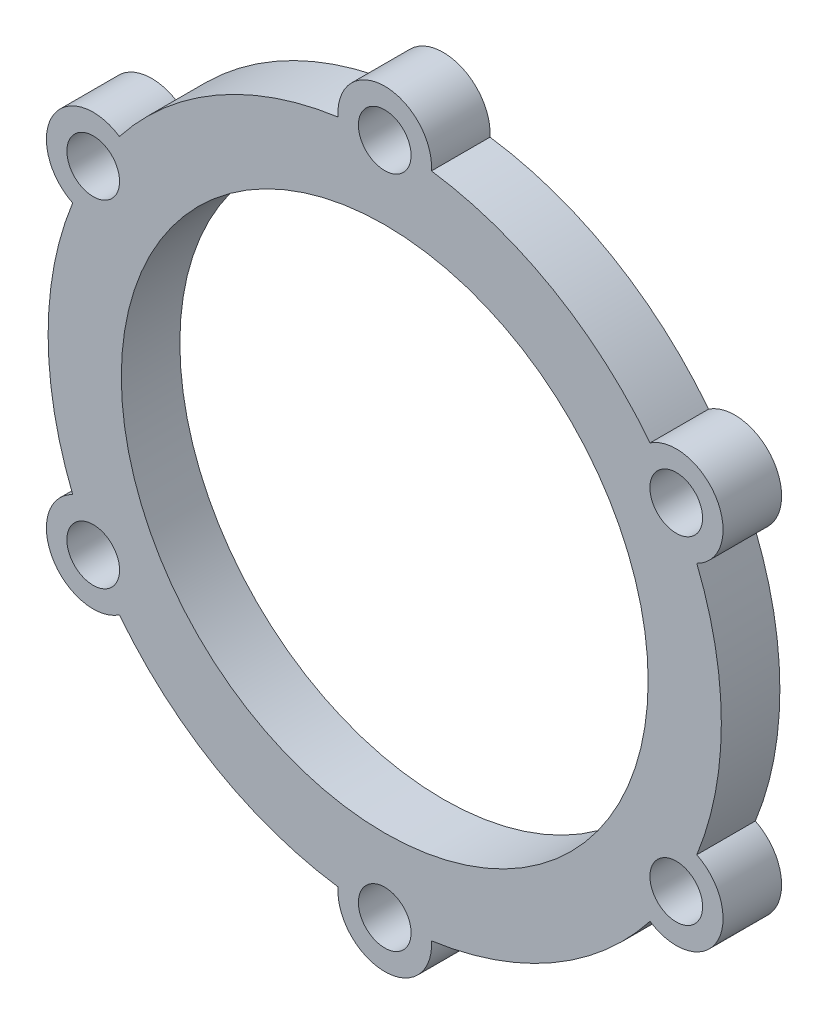
ISO-10303-21;
HEADER;
FILE_DESCRIPTION(('STEP AP214'),'2;1');
FILE_NAME('part.step','',(''),(''),'','','');
FILE_SCHEMA(('AUTOMOTIVE_DESIGN { 1 0 10303 214 1 1 1 1 }'));
ENDSEC;
DATA;
#1=APPLICATION_CONTEXT('core data for automotive mechanical design processes');
#2=APPLICATION_PROTOCOL_DEFINITION('international standard','automotive_design',2000,#1);
#3=PRODUCT_CONTEXT('',#1,'mechanical');
#4=PRODUCT('Part','Part','',(#3));
#5=PRODUCT_RELATED_PRODUCT_CATEGORY('part','',(#4));
#6=PRODUCT_DEFINITION_FORMATION('','',#4);
#7=PRODUCT_DEFINITION_CONTEXT('part definition',#1,'design');
#8=PRODUCT_DEFINITION('design','',#6,#7);
#9=PRODUCT_DEFINITION_SHAPE('','',#8);
#10=(LENGTH_UNIT() NAMED_UNIT(*) SI_UNIT(.MILLI.,.METRE.));
#11=(NAMED_UNIT(*) PLANE_ANGLE_UNIT() SI_UNIT($,.RADIAN.));
#12=(NAMED_UNIT(*) SI_UNIT($,.STERADIAN.) SOLID_ANGLE_UNIT());
#13=UNCERTAINTY_MEASURE_WITH_UNIT(LENGTH_MEASURE(1.E-05),#10,'distance_accuracy_value','');
#14=(GEOMETRIC_REPRESENTATION_CONTEXT(3) GLOBAL_UNCERTAINTY_ASSIGNED_CONTEXT((#13)) GLOBAL_UNIT_ASSIGNED_CONTEXT((#10,
#11,#12)) REPRESENTATION_CONTEXT('',''));
#15=CARTESIAN_POINT('',(0.,0.,0.));
#16=DIRECTION('',(0.,0.,1.));
#17=DIRECTION('',(1.,0.,0.));
#18=AXIS2_PLACEMENT_3D('',#15,#16,#17);
#19=CARTESIAN_POINT('',(0.,57.4999999999994,10.));
#20=DIRECTION('',(0.,0.,-1.));
#21=DIRECTION('',(-1.,0.,0.));
#22=AXIS2_PLACEMENT_3D('',#19,#20,#21);
#23=CYLINDRICAL_SURFACE('',#22,4.50000000000047);
#24=CARTESIAN_POINT('',(0.,57.4999999999994,10.));
#25=DIRECTION('',(0.,0.,1.));
#26=DIRECTION('',(1.,0.,0.));
#27=AXIS2_PLACEMENT_3D('',#24,#25,#26);
#28=CIRCLE('',#27,4.50000000000047);
#29=CARTESIAN_POINT('',(4.50000000000045,57.4999999999994,10.));
#30=VERTEX_POINT('',#29);
#31=EDGE_CURVE('E261',#30,#30,#28,.T.);
#32=ORIENTED_EDGE('',*,*,#31,.T.);
#33=EDGE_LOOP('',(#32));
#34=FACE_BOUND('',#33,.T.);
#35=CARTESIAN_POINT('',(0.,57.4999999999994,0.));
#36=DIRECTION('',(0.,0.,1.));
#37=DIRECTION('',(1.,0.,0.));
#38=AXIS2_PLACEMENT_3D('',#35,#36,#37);
#39=CIRCLE('',#38,4.50000000000047);
#40=CARTESIAN_POINT('',(4.50000000000045,57.4999999999994,0.));
#41=VERTEX_POINT('',#40);
#42=EDGE_CURVE('E302',#41,#41,#39,.T.);
#43=ORIENTED_EDGE('',*,*,#42,.F.);
#44=EDGE_LOOP('',(#43));
#45=FACE_BOUND('',#44,.T.);
#46=ADVANCED_FACE('F125',(#34,#45),#23,.F.);
#47=CARTESIAN_POINT('',(-49.796460717603,28.7499999999985,10.));
#48=DIRECTION('',(0.,0.,-1.));
#49=DIRECTION('',(-1.,0.,0.));
#50=AXIS2_PLACEMENT_3D('',#47,#48,#49);
#51=CYLINDRICAL_SURFACE('',#50,4.50000000000198);
#52=CARTESIAN_POINT('',(-49.796460717603,28.7499999999985,10.));
#53=DIRECTION('',(0.,0.,1.));
#54=DIRECTION('',(1.,0.,0.));
#55=AXIS2_PLACEMENT_3D('',#52,#53,#54);
#56=CIRCLE('',#55,4.50000000000198);
#57=CARTESIAN_POINT('',(-45.296460717601,28.7499999999985,10.));
#58=VERTEX_POINT('',#57);
#59=EDGE_CURVE('E258',#58,#58,#56,.T.);
#60=ORIENTED_EDGE('',*,*,#59,.T.);
#61=EDGE_LOOP('',(#60));
#62=FACE_BOUND('',#61,.T.);
#63=CARTESIAN_POINT('',(-49.796460717603,28.7499999999985,0.));
#64=DIRECTION('',(0.,0.,1.));
#65=DIRECTION('',(1.,0.,0.));
#66=AXIS2_PLACEMENT_3D('',#63,#64,#65);
#67=CIRCLE('',#66,4.50000000000198);
#68=CARTESIAN_POINT('',(-45.296460717601,28.7499999999985,0.));
#69=VERTEX_POINT('',#68);
#70=EDGE_CURVE('E299',#69,#69,#67,.T.);
#71=ORIENTED_EDGE('',*,*,#70,.F.);
#72=EDGE_LOOP('',(#71));
#73=FACE_BOUND('',#72,.T.);
#74=ADVANCED_FACE('F377',(#62,#73),#51,.F.);
#75=CARTESIAN_POINT('',(-49.7964607176011,-28.75,10.));
#76=DIRECTION('',(0.,0.,-1.));
#77=DIRECTION('',(-1.,0.,0.));
#78=AXIS2_PLACEMENT_3D('',#75,#76,#77);
#79=CYLINDRICAL_SURFACE('',#78,4.5000000000044);
#80=CARTESIAN_POINT('',(-49.7964607176011,-28.75,10.));
#81=DIRECTION('',(0.,0.,1.));
#82=DIRECTION('',(1.,0.,0.));
#83=AXIS2_PLACEMENT_3D('',#80,#81,#82);
#84=CIRCLE('',#83,4.5000000000044);
#85=CARTESIAN_POINT('',(-45.2964607175967,-28.75,10.));
#86=VERTEX_POINT('',#85);
#87=EDGE_CURVE('E255',#86,#86,#84,.T.);
#88=ORIENTED_EDGE('',*,*,#87,.T.);
#89=EDGE_LOOP('',(#88));
#90=FACE_BOUND('',#89,.T.);
#91=CARTESIAN_POINT('',(-49.7964607176011,-28.75,0.));
#92=DIRECTION('',(0.,0.,1.));
#93=DIRECTION('',(1.,0.,0.));
#94=AXIS2_PLACEMENT_3D('',#91,#92,#93);
#95=CIRCLE('',#94,4.5000000000044);
#96=CARTESIAN_POINT('',(-45.2964607175967,-28.75,0.));
#97=VERTEX_POINT('',#96);
#98=EDGE_CURVE('E296',#97,#97,#95,.T.);
#99=ORIENTED_EDGE('',*,*,#98,.F.);
#100=EDGE_LOOP('',(#99));
#101=FACE_BOUND('',#100,.T.);
#102=ADVANCED_FACE('F383',(#90,#101),#79,.F.);
#103=CARTESIAN_POINT('',(49.7964607176067,-28.749999999998,10.));
#104=DIRECTION('',(0.,0.,-1.));
#105=DIRECTION('',(-1.,0.,0.));
#106=AXIS2_PLACEMENT_3D('',#103,#104,#105);
#107=CYLINDRICAL_SURFACE('',#106,4.50000000000166);
#108=CARTESIAN_POINT('',(49.7964607176067,-28.749999999998,10.));
#109=DIRECTION('',(0.,0.,1.));
#110=DIRECTION('',(1.,0.,0.));
#111=AXIS2_PLACEMENT_3D('',#108,#109,#110);
#112=CIRCLE('',#111,4.50000000000166);
#113=CARTESIAN_POINT('',(54.2964607176084,-28.749999999998,10.));
#114=VERTEX_POINT('',#113);
#115=EDGE_CURVE('E252',#114,#114,#112,.T.);
#116=ORIENTED_EDGE('',*,*,#115,.T.);
#117=EDGE_LOOP('',(#116));
#118=FACE_BOUND('',#117,.T.);
#119=CARTESIAN_POINT('',(49.7964607176067,-28.749999999998,0.));
#120=DIRECTION('',(0.,0.,1.));
#121=DIRECTION('',(1.,0.,0.));
#122=AXIS2_PLACEMENT_3D('',#119,#120,#121);
#123=CIRCLE('',#122,4.50000000000166);
#124=CARTESIAN_POINT('',(54.2964607176084,-28.749999999998,0.));
#125=VERTEX_POINT('',#124);
#126=EDGE_CURVE('E293',#125,#125,#123,.T.);
#127=ORIENTED_EDGE('',*,*,#126,.F.);
#128=EDGE_LOOP('',(#127));
#129=FACE_BOUND('',#128,.T.);
#130=ADVANCED_FACE('F390',(#118,#129),#107,.F.);
#131=CARTESIAN_POINT('',(49.7964607176055,28.7500000000017,10.));
#132=DIRECTION('',(0.,0.,-1.));
#133=DIRECTION('',(-1.,0.,0.));
#134=AXIS2_PLACEMENT_3D('',#131,#132,#133);
#135=CYLINDRICAL_SURFACE('',#134,4.50000000000025);
#136=CARTESIAN_POINT('',(49.7964607176055,28.7500000000017,10.));
#137=DIRECTION('',(0.,0.,1.));
#138=DIRECTION('',(1.,0.,0.));
#139=AXIS2_PLACEMENT_3D('',#136,#137,#138);
#140=CIRCLE('',#139,4.50000000000025);
#141=CARTESIAN_POINT('',(54.2964607176057,28.7500000000017,10.));
#142=VERTEX_POINT('',#141);
#143=EDGE_CURVE('E246',#142,#142,#140,.T.);
#144=ORIENTED_EDGE('',*,*,#143,.T.);
#145=EDGE_LOOP('',(#144));
#146=FACE_BOUND('',#145,.T.);
#147=CARTESIAN_POINT('',(49.7964607176055,28.7500000000017,0.));
#148=DIRECTION('',(0.,0.,1.));
#149=DIRECTION('',(1.,0.,0.));
#150=AXIS2_PLACEMENT_3D('',#147,#148,#149);
#151=CIRCLE('',#150,4.50000000000025);
#152=CARTESIAN_POINT('',(54.2964607176057,28.7500000000017,0.));
#153=VERTEX_POINT('',#152);
#154=EDGE_CURVE('E290',#153,#153,#151,.T.);
#155=ORIENTED_EDGE('',*,*,#154,.F.);
#156=EDGE_LOOP('',(#155));
#157=FACE_BOUND('',#156,.T.);
#158=ADVANCED_FACE('F394',(#146,#157),#135,.F.);
#159=CARTESIAN_POINT('',(0.,57.4999999999994,10.));
#160=DIRECTION('',(0.,0.,-1.));
#161=DIRECTION('',(-1.,0.,0.));
#162=AXIS2_PLACEMENT_3D('',#159,#160,#161);
#163=CYLINDRICAL_SURFACE('',#162,8.00000000000046);
#164=CARTESIAN_POINT('',(0.,57.4999999999994,0.));
#165=DIRECTION('',(0.,0.,1.));
#166=DIRECTION('',(1.,0.,0.));
#167=AXIS2_PLACEMENT_3D('',#164,#165,#166);
#168=CIRCLE('',#167,8.00000000000046);
#169=CARTESIAN_POINT('',(7.98061924626673,56.9434782608695,0.));
#170=VERTEX_POINT('',#169);
#171=CARTESIAN_POINT('',(-7.98061924626677,56.9434782608695,0.));
#172=VERTEX_POINT('',#171);
#173=EDGE_CURVE('E272',#170,#172,#168,.T.);
#174=ORIENTED_EDGE('',*,*,#173,.T.);
#175=DIRECTION('',(0.,0.,-1.));
#176=VECTOR('',#175,1.);
#177=CARTESIAN_POINT('',(-7.98061924626677,56.9434782608695,10.));
#178=LINE('',#177,#176);
#179=CARTESIAN_POINT('',(-7.98061924626677,56.9434782608695,10.));
#180=VERTEX_POINT('',#179);
#181=EDGE_CURVE('E135',#180,#172,#178,.T.);
#182=ORIENTED_EDGE('',*,*,#181,.F.);
#183=CARTESIAN_POINT('',(0.,57.4999999999994,10.));
#184=DIRECTION('',(0.,0.,1.));
#185=DIRECTION('',(1.,0.,0.));
#186=AXIS2_PLACEMENT_3D('',#183,#184,#185);
#187=CIRCLE('',#186,8.00000000000046);
#188=CARTESIAN_POINT('',(7.98061924626673,56.9434782608695,10.));
#189=VERTEX_POINT('',#188);
#190=EDGE_CURVE('E199',#189,#180,#187,.T.);
#191=ORIENTED_EDGE('',*,*,#190,.F.);
#192=DIRECTION('',(0.,0.,-1.));
#193=VECTOR('',#192,1.);
#194=CARTESIAN_POINT('',(7.98061924626673,56.9434782608695,10.));
#195=LINE('',#194,#193);
#196=EDGE_CURVE('E12',#189,#170,#195,.T.);
#197=ORIENTED_EDGE('',*,*,#196,.T.);
#198=EDGE_LOOP('',(#174,#182,#191,#197));
#199=FACE_BOUND('',#198,.T.);
#200=ADVANCED_FACE('F398',(#199),#163,.T.);
#201=CARTESIAN_POINT('',(0.,0.,10.));
#202=DIRECTION('',(0.,0.,-1.));
#203=DIRECTION('',(-1.,0.,0.));
#204=AXIS2_PLACEMENT_3D('',#201,#202,#203);
#205=CYLINDRICAL_SURFACE('',#204,57.5);
#206=CARTESIAN_POINT('',(0.,0.,0.));
#207=DIRECTION('',(0.,0.,1.));
#208=DIRECTION('',(1.,0.,0.));
#209=AXIS2_PLACEMENT_3D('',#206,#207,#208);
#210=CIRCLE('',#209,57.5);
#211=CARTESIAN_POINT('',(-45.3241891306256,35.383158135634,0.));
#212=VERTEX_POINT('',#211);
#213=EDGE_CURVE('E274',#172,#212,#210,.T.);
#214=ORIENTED_EDGE('',*,*,#213,.T.);
#215=DIRECTION('',(0.,0.,-1.));
#216=VECTOR('',#215,1.);
#217=CARTESIAN_POINT('',(-45.3241891306256,35.383158135634,10.));
#218=LINE('',#217,#216);
#219=CARTESIAN_POINT('',(-45.3241891306256,35.383158135634,10.));
#220=VERTEX_POINT('',#219);
#221=EDGE_CURVE('E322',#220,#212,#218,.T.);
#222=ORIENTED_EDGE('',*,*,#221,.F.);
#223=CARTESIAN_POINT('',(0.,0.,10.));
#224=DIRECTION('',(0.,0.,1.));
#225=DIRECTION('',(1.,0.,0.));
#226=AXIS2_PLACEMENT_3D('',#223,#224,#225);
#227=CIRCLE('',#226,57.5);
#228=EDGE_CURVE('E354',#180,#220,#227,.T.);
#229=ORIENTED_EDGE('',*,*,#228,.F.);
#230=ORIENTED_EDGE('',*,*,#181,.T.);
#231=EDGE_LOOP('',(#214,#222,#229,#230));
#232=FACE_BOUND('',#231,.T.);
#233=ADVANCED_FACE('F425',(#232),#205,.T.);
#234=CARTESIAN_POINT('',(-49.796460717603,28.7499999999985,10.));
#235=DIRECTION('',(0.,0.,-1.));
#236=DIRECTION('',(-1.,0.,0.));
#237=AXIS2_PLACEMENT_3D('',#234,#235,#236);
#238=CYLINDRICAL_SURFACE('',#237,8.00000000000197);
#239=CARTESIAN_POINT('',(-49.796460717603,28.7499999999985,0.));
#240=DIRECTION('',(0.,0.,1.));
#241=DIRECTION('',(1.,0.,0.));
#242=AXIS2_PLACEMENT_3D('',#239,#240,#241);
#243=CIRCLE('',#242,8.00000000000197);
#244=CARTESIAN_POINT('',(-53.3048083768936,21.5603201252361,0.));
#245=VERTEX_POINT('',#244);
#246=EDGE_CURVE('E276',#212,#245,#243,.T.);
#247=ORIENTED_EDGE('',*,*,#246,.T.);
#248=DIRECTION('',(0.,0.,-1.));
#249=VECTOR('',#248,1.);
#250=CARTESIAN_POINT('',(-53.3048083768936,21.5603201252361,10.));
#251=LINE('',#250,#249);
#252=CARTESIAN_POINT('',(-53.3048083768936,21.5603201252361,10.));
#253=VERTEX_POINT('',#252);
#254=EDGE_CURVE('E319',#253,#245,#251,.T.);
#255=ORIENTED_EDGE('',*,*,#254,.F.);
#256=CARTESIAN_POINT('',(-49.796460717603,28.7499999999985,10.));
#257=DIRECTION('',(0.,0.,1.));
#258=DIRECTION('',(1.,0.,0.));
#259=AXIS2_PLACEMENT_3D('',#256,#257,#258);
#260=CIRCLE('',#259,8.00000000000197);
#261=EDGE_CURVE('E352',#220,#253,#260,.T.);
#262=ORIENTED_EDGE('',*,*,#261,.F.);
#263=ORIENTED_EDGE('',*,*,#221,.T.);
#264=EDGE_LOOP('',(#247,#255,#262,#263));
#265=FACE_BOUND('',#264,.T.);
#266=ADVANCED_FACE('F421',(#265),#238,.T.);
#267=CARTESIAN_POINT('',(0.,0.,10.));
#268=DIRECTION('',(0.,0.,-1.));
#269=DIRECTION('',(-1.,0.,0.));
#270=AXIS2_PLACEMENT_3D('',#267,#268,#269);
#271=CYLINDRICAL_SURFACE('',#270,57.5);
#272=CARTESIAN_POINT('',(0.,0.,0.));
#273=DIRECTION('',(0.,0.,1.));
#274=DIRECTION('',(1.,0.,0.));
#275=AXIS2_PLACEMENT_3D('',#272,#273,#274);
#276=CIRCLE('',#275,57.5);
#277=CARTESIAN_POINT('',(-53.3048083768935,-21.5603201252367,0.));
#278=VERTEX_POINT('',#277);
#279=EDGE_CURVE('E278',#245,#278,#276,.T.);
#280=ORIENTED_EDGE('',*,*,#279,.T.);
#281=DIRECTION('',(0.,0.,-1.));
#282=VECTOR('',#281,1.);
#283=CARTESIAN_POINT('',(-53.3048083768935,-21.5603201252367,10.));
#284=LINE('',#283,#282);
#285=CARTESIAN_POINT('',(-53.3048083768935,-21.5603201252367,10.));
#286=VERTEX_POINT('',#285);
#287=EDGE_CURVE('E316',#286,#278,#284,.T.);
#288=ORIENTED_EDGE('',*,*,#287,.F.);
#289=CARTESIAN_POINT('',(0.,0.,10.));
#290=DIRECTION('',(0.,0.,1.));
#291=DIRECTION('',(1.,0.,0.));
#292=AXIS2_PLACEMENT_3D('',#289,#290,#291);
#293=CIRCLE('',#292,57.5);
#294=EDGE_CURVE('E350',#253,#286,#293,.T.);
#295=ORIENTED_EDGE('',*,*,#294,.F.);
#296=ORIENTED_EDGE('',*,*,#254,.T.);
#297=EDGE_LOOP('',(#280,#288,#295,#296));
#298=FACE_BOUND('',#297,.T.);
#299=ADVANCED_FACE('F417',(#298),#271,.T.);
#300=CARTESIAN_POINT('',(-49.7964607176011,-28.75,10.));
#301=DIRECTION('',(0.,0.,-1.));
#302=DIRECTION('',(-1.,0.,0.));
#303=AXIS2_PLACEMENT_3D('',#300,#301,#302);
#304=CYLINDRICAL_SURFACE('',#303,8.00000000000439);
#305=CARTESIAN_POINT('',(-49.7964607176011,-28.75,0.));
#306=DIRECTION('',(0.,0.,1.));
#307=DIRECTION('',(1.,0.,0.));
#308=AXIS2_PLACEMENT_3D('',#305,#306,#307);
#309=CIRCLE('',#308,8.00000000000439);
#310=CARTESIAN_POINT('',(-45.3241891306227,-35.3831581356377,0.));
#311=VERTEX_POINT('',#310);
#312=EDGE_CURVE('E280',#278,#311,#309,.T.);
#313=ORIENTED_EDGE('',*,*,#312,.T.);
#314=DIRECTION('',(0.,0.,-1.));
#315=VECTOR('',#314,1.);
#316=CARTESIAN_POINT('',(-45.3241891306227,-35.3831581356377,10.));
#317=LINE('',#316,#315);
#318=CARTESIAN_POINT('',(-45.3241891306227,-35.3831581356377,10.));
#319=VERTEX_POINT('',#318);
#320=EDGE_CURVE('E313',#319,#311,#317,.T.);
#321=ORIENTED_EDGE('',*,*,#320,.F.);
#322=CARTESIAN_POINT('',(-49.7964607176011,-28.75,10.));
#323=DIRECTION('',(0.,0.,1.));
#324=DIRECTION('',(1.,0.,0.));
#325=AXIS2_PLACEMENT_3D('',#322,#323,#324);
#326=CIRCLE('',#325,8.00000000000439);
#327=EDGE_CURVE('E346',#286,#319,#326,.T.);
#328=ORIENTED_EDGE('',*,*,#327,.F.);
#329=ORIENTED_EDGE('',*,*,#287,.T.);
#330=EDGE_LOOP('',(#313,#321,#328,#329));
#331=FACE_BOUND('',#330,.T.);
#332=ADVANCED_FACE('F413',(#331),#304,.T.);
#333=CARTESIAN_POINT('',(0.,0.,10.));
#334=DIRECTION('',(0.,0.,-1.));
#335=DIRECTION('',(-1.,0.,0.));
#336=AXIS2_PLACEMENT_3D('',#333,#334,#335);
#337=CYLINDRICAL_SURFACE('',#336,57.5);
#338=CARTESIAN_POINT('',(0.,0.,0.));
#339=DIRECTION('',(0.,0.,1.));
#340=DIRECTION('',(1.,0.,0.));
#341=AXIS2_PLACEMENT_3D('',#338,#339,#340);
#342=CIRCLE('',#341,57.5);
#343=CARTESIAN_POINT('',(-7.98061924626658,-56.9434782608695,0.));
#344=VERTEX_POINT('',#343);
#345=EDGE_CURVE('E282',#311,#344,#342,.T.);
#346=ORIENTED_EDGE('',*,*,#345,.T.);
#347=DIRECTION('',(0.,0.,-1.));
#348=VECTOR('',#347,1.);
#349=CARTESIAN_POINT('',(-7.98061924626658,-56.9434782608695,10.));
#350=LINE('',#349,#348);
#351=CARTESIAN_POINT('',(-7.98061924626658,-56.9434782608695,10.));
#352=VERTEX_POINT('',#351);
#353=EDGE_CURVE('E311',#352,#344,#350,.T.);
#354=ORIENTED_EDGE('',*,*,#353,.F.);
#355=CARTESIAN_POINT('',(0.,0.,10.));
#356=DIRECTION('',(0.,0.,1.));
#357=DIRECTION('',(1.,0.,0.));
#358=AXIS2_PLACEMENT_3D('',#355,#356,#357);
#359=CIRCLE('',#358,57.5);
#360=EDGE_CURVE('E345',#319,#352,#359,.T.);
#361=ORIENTED_EDGE('',*,*,#360,.F.);
#362=ORIENTED_EDGE('',*,*,#320,.T.);
#363=EDGE_LOOP('',(#346,#354,#361,#362));
#364=FACE_BOUND('',#363,.T.);
#365=ADVANCED_FACE('F410',(#364),#337,.T.);
#366=CARTESIAN_POINT('',(0.,0.,10.));
#367=DIRECTION('',(0.,0.,-1.));
#368=DIRECTION('',(-1.,0.,0.));
#369=AXIS2_PLACEMENT_3D('',#366,#367,#368);
#370=CYLINDRICAL_SURFACE('',#369,57.5);
#371=CARTESIAN_POINT('',(0.,0.,0.));
#372=DIRECTION('',(0.,0.,1.));
#373=DIRECTION('',(1.,0.,0.));
#374=AXIS2_PLACEMENT_3D('',#371,#372,#373);
#375=CIRCLE('',#374,57.5);
#376=CARTESIAN_POINT('',(7.98061924627193,-56.9434782608688,0.));
#377=VERTEX_POINT('',#376);
#378=CARTESIAN_POINT('',(45.3241891306274,-35.3831581356317,0.));
#379=VERTEX_POINT('',#378);
#380=EDGE_CURVE('E285',#377,#379,#375,.T.);
#381=ORIENTED_EDGE('',*,*,#380,.T.);
#382=DIRECTION('',(0.,0.,-1.));
#383=VECTOR('',#382,1.);
#384=CARTESIAN_POINT('',(45.3241891306274,-35.3831581356317,10.));
#385=LINE('',#384,#383);
#386=CARTESIAN_POINT('',(45.3241891306274,-35.3831581356317,10.));
#387=VERTEX_POINT('',#386);
#388=EDGE_CURVE('E241',#387,#379,#385,.T.);
#389=ORIENTED_EDGE('',*,*,#388,.F.);
#390=CARTESIAN_POINT('',(0.,0.,10.));
#391=DIRECTION('',(0.,0.,1.));
#392=DIRECTION('',(1.,0.,0.));
#393=AXIS2_PLACEMENT_3D('',#390,#391,#392);
#394=CIRCLE('',#393,57.5);
#395=CARTESIAN_POINT('',(7.98061924627193,-56.9434782608688,10.));
#396=VERTEX_POINT('',#395);
#397=EDGE_CURVE('E232',#396,#387,#394,.T.);
#398=ORIENTED_EDGE('',*,*,#397,.F.);
#399=DIRECTION('',(0.,0.,-1.));
#400=VECTOR('',#399,1.);
#401=CARTESIAN_POINT('',(7.98061924627193,-56.9434782608688,10.));
#402=LINE('',#401,#400);
#403=EDGE_CURVE('E309',#396,#377,#402,.T.);
#404=ORIENTED_EDGE('',*,*,#403,.T.);
#405=EDGE_LOOP('',(#381,#389,#398,#404));
#406=FACE_BOUND('',#405,.T.);
#407=ADVANCED_FACE('F344',(#406),#370,.T.);
#408=CARTESIAN_POINT('',(49.7964607176067,-28.749999999998,10.));
#409=DIRECTION('',(0.,0.,-1.));
#410=DIRECTION('',(-1.,0.,0.));
#411=AXIS2_PLACEMENT_3D('',#408,#409,#410);
#412=CYLINDRICAL_SURFACE('',#411,8.00000000000166);
#413=CARTESIAN_POINT('',(49.7964607176067,-28.749999999998,0.));
#414=DIRECTION('',(0.,0.,1.));
#415=DIRECTION('',(1.,0.,0.));
#416=AXIS2_PLACEMENT_3D('',#413,#414,#415);
#417=CIRCLE('',#416,8.00000000000166);
#418=CARTESIAN_POINT('',(53.3048083768947,-21.5603201252334,0.));
#419=VERTEX_POINT('',#418);
#420=EDGE_CURVE('E240',#379,#419,#417,.T.);
#421=ORIENTED_EDGE('',*,*,#420,.T.);
#422=DIRECTION('',(0.,0.,-1.));
#423=VECTOR('',#422,1.);
#424=CARTESIAN_POINT('',(53.3048083768947,-21.5603201252334,10.));
#425=LINE('',#424,#423);
#426=CARTESIAN_POINT('',(53.3048083768947,-21.5603201252334,10.));
#427=VERTEX_POINT('',#426);
#428=EDGE_CURVE('E237',#427,#419,#425,.T.);
#429=ORIENTED_EDGE('',*,*,#428,.F.);
#430=CARTESIAN_POINT('',(49.7964607176067,-28.749999999998,10.));
#431=DIRECTION('',(0.,0.,1.));
#432=DIRECTION('',(1.,0.,0.));
#433=AXIS2_PLACEMENT_3D('',#430,#431,#432);
#434=CIRCLE('',#433,8.00000000000166);
#435=EDGE_CURVE('E224',#387,#427,#434,.T.);
#436=ORIENTED_EDGE('',*,*,#435,.F.);
#437=ORIENTED_EDGE('',*,*,#388,.T.);
#438=EDGE_LOOP('',(#421,#429,#436,#437));
#439=FACE_BOUND('',#438,.T.);
#440=ADVANCED_FACE('F238',(#439),#412,.T.);
#441=CARTESIAN_POINT('',(0.,0.,10.));
#442=DIRECTION('',(0.,0.,-1.));
#443=DIRECTION('',(-1.,0.,0.));
#444=AXIS2_PLACEMENT_3D('',#441,#442,#443);
#445=CYLINDRICAL_SURFACE('',#444,57.5);
#446=CARTESIAN_POINT('',(0.,0.,0.));
#447=DIRECTION('',(0.,0.,1.));
#448=DIRECTION('',(1.,0.,0.));
#449=AXIS2_PLACEMENT_3D('',#446,#447,#448);
#450=CIRCLE('',#449,57.5);
#451=CARTESIAN_POINT('',(53.3048083768927,21.5603201252383,0.));
#452=VERTEX_POINT('',#451);
#453=EDGE_CURVE('E185',#419,#452,#450,.T.);
#454=ORIENTED_EDGE('',*,*,#453,.T.);
#455=DIRECTION('',(0.,0.,-1.));
#456=VECTOR('',#455,1.);
#457=CARTESIAN_POINT('',(53.3048083768927,21.5603201252383,10.));
#458=LINE('',#457,#456);
#459=CARTESIAN_POINT('',(53.3048083768927,21.5603201252383,10.));
#460=VERTEX_POINT('',#459);
#461=EDGE_CURVE('E242',#460,#452,#458,.T.);
#462=ORIENTED_EDGE('',*,*,#461,.F.);
#463=CARTESIAN_POINT('',(0.,0.,10.));
#464=DIRECTION('',(0.,0.,1.));
#465=DIRECTION('',(1.,0.,0.));
#466=AXIS2_PLACEMENT_3D('',#463,#464,#465);
#467=CIRCLE('',#466,57.5);
#468=EDGE_CURVE('E229',#427,#460,#467,.T.);
#469=ORIENTED_EDGE('',*,*,#468,.F.);
#470=ORIENTED_EDGE('',*,*,#428,.T.);
#471=EDGE_LOOP('',(#454,#462,#469,#470));
#472=FACE_BOUND('',#471,.T.);
#473=ADVANCED_FACE('F244',(#472),#445,.T.);
#474=CARTESIAN_POINT('',(49.7964607176055,28.7500000000017,10.));
#475=DIRECTION('',(0.,0.,-1.));
#476=DIRECTION('',(-1.,0.,0.));
#477=AXIS2_PLACEMENT_3D('',#474,#475,#476);
#478=CYLINDRICAL_SURFACE('',#477,8.00000000000025);
#479=CARTESIAN_POINT('',(49.7964607176055,28.7500000000017,0.));
#480=DIRECTION('',(0.,0.,1.));
#481=DIRECTION('',(1.,0.,0.));
#482=AXIS2_PLACEMENT_3D('',#479,#480,#481);
#483=CIRCLE('',#482,8.00000000000025);
#484=CARTESIAN_POINT('',(45.3241891306259,35.3831581356336,0.));
#485=VERTEX_POINT('',#484);
#486=EDGE_CURVE('E191',#452,#485,#483,.T.);
#487=ORIENTED_EDGE('',*,*,#486,.T.);
#488=DIRECTION('',(0.,0.,-1.));
#489=VECTOR('',#488,1.);
#490=CARTESIAN_POINT('',(45.3241891306259,35.3831581356336,10.));
#491=LINE('',#490,#489);
#492=CARTESIAN_POINT('',(45.3241891306259,35.3831581356336,10.));
#493=VERTEX_POINT('',#492);
#494=EDGE_CURVE('E264',#493,#485,#491,.T.);
#495=ORIENTED_EDGE('',*,*,#494,.F.);
#496=CARTESIAN_POINT('',(49.7964607176055,28.7500000000017,10.));
#497=DIRECTION('',(0.,0.,1.));
#498=DIRECTION('',(1.,0.,0.));
#499=AXIS2_PLACEMENT_3D('',#496,#497,#498);
#500=CIRCLE('',#499,8.00000000000025);
#501=EDGE_CURVE('E144',#460,#493,#500,.T.);
#502=ORIENTED_EDGE('',*,*,#501,.F.);
#503=ORIENTED_EDGE('',*,*,#461,.T.);
#504=EDGE_LOOP('',(#487,#495,#502,#503));
#505=FACE_BOUND('',#504,.T.);
#506=ADVANCED_FACE('F400',(#505),#478,.T.);
#507=CARTESIAN_POINT('',(0.,0.,10.));
#508=DIRECTION('',(0.,0.,-1.));
#509=DIRECTION('',(-1.,0.,0.));
#510=AXIS2_PLACEMENT_3D('',#507,#508,#509);
#511=CYLINDRICAL_SURFACE('',#510,57.5);
#512=CARTESIAN_POINT('',(0.,0.,0.));
#513=DIRECTION('',(0.,0.,1.));
#514=DIRECTION('',(1.,0.,0.));
#515=AXIS2_PLACEMENT_3D('',#512,#513,#514);
#516=CIRCLE('',#515,57.5);
#517=EDGE_CURVE('E268',#485,#170,#516,.T.);
#518=ORIENTED_EDGE('',*,*,#517,.T.);
#519=ORIENTED_EDGE('',*,*,#196,.F.);
#520=CARTESIAN_POINT('',(0.,0.,10.));
#521=DIRECTION('',(0.,0.,1.));
#522=DIRECTION('',(1.,0.,0.));
#523=AXIS2_PLACEMENT_3D('',#520,#521,#522);
#524=CIRCLE('',#523,57.5);
#525=EDGE_CURVE('E357',#493,#189,#524,.T.);
#526=ORIENTED_EDGE('',*,*,#525,.F.);
#527=ORIENTED_EDGE('',*,*,#494,.T.);
#528=EDGE_LOOP('',(#518,#519,#526,#527));
#529=FACE_BOUND('',#528,.T.);
#530=ADVANCED_FACE('F403',(#529),#511,.T.);
#531=CARTESIAN_POINT('',(0.,0.,10.));
#532=DIRECTION('',(0.,0.,-1.));
#533=DIRECTION('',(-1.,0.,0.));
#534=AXIS2_PLACEMENT_3D('',#531,#532,#533);
#535=CYLINDRICAL_SURFACE('',#534,45.);
#536=CARTESIAN_POINT('',(0.,0.,10.));
#537=DIRECTION('',(0.,0.,1.));
#538=DIRECTION('',(1.,0.,0.));
#539=AXIS2_PLACEMENT_3D('',#536,#537,#538);
#540=CIRCLE('',#539,45.);
#541=CARTESIAN_POINT('',(45.,0.,10.));
#542=VERTEX_POINT('',#541);
#543=EDGE_CURVE('E305',#542,#542,#540,.T.);
#544=ORIENTED_EDGE('',*,*,#543,.T.);
#545=EDGE_LOOP('',(#544));
#546=FACE_BOUND('',#545,.T.);
#547=CARTESIAN_POINT('',(0.,0.,0.));
#548=DIRECTION('',(0.,0.,1.));
#549=DIRECTION('',(1.,0.,0.));
#550=AXIS2_PLACEMENT_3D('',#547,#548,#549);
#551=CIRCLE('',#550,45.);
#552=CARTESIAN_POINT('',(45.,0.,0.));
#553=VERTEX_POINT('',#552);
#554=EDGE_CURVE('E265',#553,#553,#551,.T.);
#555=ORIENTED_EDGE('',*,*,#554,.F.);
#556=EDGE_LOOP('',(#555));
#557=FACE_BOUND('',#556,.T.);
#558=ADVANCED_FACE('F362',(#546,#557),#535,.F.);
#559=CARTESIAN_POINT('',(0.,0.,0.));
#560=DIRECTION('',(0.,0.,1.));
#561=DIRECTION('',(1.,0.,0.));
#562=AXIS2_PLACEMENT_3D('',#559,#560,#561);
#563=PLANE('',#562);
#564=ORIENTED_EDGE('',*,*,#554,.T.);
#565=EDGE_LOOP('',(#564));
#566=FACE_BOUND('',#565,.T.);
#567=ORIENTED_EDGE('',*,*,#517,.F.);
#568=ORIENTED_EDGE('',*,*,#486,.F.);
#569=ORIENTED_EDGE('',*,*,#453,.F.);
#570=ORIENTED_EDGE('',*,*,#420,.F.);
#571=ORIENTED_EDGE('',*,*,#380,.F.);
#572=CARTESIAN_POINT('',(2.70323089647533E-12,-57.4999999999989,0.));
#573=DIRECTION('',(0.,0.,1.));
#574=DIRECTION('',(1.,0.,0.));
#575=AXIS2_PLACEMENT_3D('',#572,#573,#574);
#576=CIRCLE('',#575,8.00000000000295);
#577=EDGE_CURVE('E129',#344,#377,#576,.T.);
#578=ORIENTED_EDGE('',*,*,#577,.F.);
#579=ORIENTED_EDGE('',*,*,#345,.F.);
#580=ORIENTED_EDGE('',*,*,#312,.F.);
#581=ORIENTED_EDGE('',*,*,#279,.F.);
#582=ORIENTED_EDGE('',*,*,#246,.F.);
#583=ORIENTED_EDGE('',*,*,#213,.F.);
#584=ORIENTED_EDGE('',*,*,#173,.F.);
#585=EDGE_LOOP('',(#567,#568,#569,#570,#571,#578,#579,#580,#581,#582,#583,#584));
#586=FACE_BOUND('',#585,.T.);
#587=ORIENTED_EDGE('',*,*,#154,.T.);
#588=EDGE_LOOP('',(#587));
#589=FACE_BOUND('',#588,.T.);
#590=ORIENTED_EDGE('',*,*,#126,.T.);
#591=EDGE_LOOP('',(#590));
#592=FACE_BOUND('',#591,.T.);
#593=ORIENTED_EDGE('',*,*,#98,.T.);
#594=EDGE_LOOP('',(#593));
#595=FACE_BOUND('',#594,.T.);
#596=ORIENTED_EDGE('',*,*,#70,.T.);
#597=EDGE_LOOP('',(#596));
#598=FACE_BOUND('',#597,.T.);
#599=ORIENTED_EDGE('',*,*,#42,.T.);
#600=EDGE_LOOP('',(#599));
#601=FACE_BOUND('',#600,.T.);
#602=CARTESIAN_POINT('',(2.70323089647533E-12,-57.4999999999989,0.));
#603=DIRECTION('',(0.,0.,1.));
#604=DIRECTION('',(1.,0.,0.));
#605=AXIS2_PLACEMENT_3D('',#602,#603,#604);
#606=CIRCLE('',#605,4.50000000000296);
#607=CARTESIAN_POINT('',(4.50000000000566,-57.4999999999989,0.));
#608=VERTEX_POINT('',#607);
#609=EDGE_CURVE('E330',#608,#608,#606,.T.);
#610=ORIENTED_EDGE('',*,*,#609,.T.);
#611=EDGE_LOOP('',(#610));
#612=FACE_BOUND('',#611,.T.);
#613=ADVANCED_FACE('F341',(#566,#586,#589,#592,#595,#598,#601,#612),#563,.F.);
#614=CARTESIAN_POINT('',(0.,0.,10.));
#615=DIRECTION('',(0.,0.,1.));
#616=DIRECTION('',(1.,0.,0.));
#617=AXIS2_PLACEMENT_3D('',#614,#615,#616);
#618=PLANE('',#617);
#619=ORIENTED_EDGE('',*,*,#543,.F.);
#620=EDGE_LOOP('',(#619));
#621=FACE_BOUND('',#620,.T.);
#622=ORIENTED_EDGE('',*,*,#525,.T.);
#623=ORIENTED_EDGE('',*,*,#190,.T.);
#624=ORIENTED_EDGE('',*,*,#228,.T.);
#625=ORIENTED_EDGE('',*,*,#261,.T.);
#626=ORIENTED_EDGE('',*,*,#294,.T.);
#627=ORIENTED_EDGE('',*,*,#327,.T.);
#628=ORIENTED_EDGE('',*,*,#360,.T.);
#629=CARTESIAN_POINT('',(2.70323089647533E-12,-57.4999999999989,10.));
#630=DIRECTION('',(0.,0.,1.));
#631=DIRECTION('',(1.,0.,0.));
#632=AXIS2_PLACEMENT_3D('',#629,#630,#631);
#633=CIRCLE('',#632,8.00000000000295);
#634=EDGE_CURVE('E269',#352,#396,#633,.T.);
#635=ORIENTED_EDGE('',*,*,#634,.T.);
#636=ORIENTED_EDGE('',*,*,#397,.T.);
#637=ORIENTED_EDGE('',*,*,#435,.T.);
#638=ORIENTED_EDGE('',*,*,#468,.T.);
#639=ORIENTED_EDGE('',*,*,#501,.T.);
#640=EDGE_LOOP('',(#622,#623,#624,#625,#626,#627,#628,#635,#636,#637,#638,#639));
#641=FACE_BOUND('',#640,.T.);
#642=ORIENTED_EDGE('',*,*,#143,.F.);
#643=EDGE_LOOP('',(#642));
#644=FACE_BOUND('',#643,.T.);
#645=ORIENTED_EDGE('',*,*,#115,.F.);
#646=EDGE_LOOP('',(#645));
#647=FACE_BOUND('',#646,.T.);
#648=ORIENTED_EDGE('',*,*,#87,.F.);
#649=EDGE_LOOP('',(#648));
#650=FACE_BOUND('',#649,.T.);
#651=ORIENTED_EDGE('',*,*,#59,.F.);
#652=EDGE_LOOP('',(#651));
#653=FACE_BOUND('',#652,.T.);
#654=ORIENTED_EDGE('',*,*,#31,.F.);
#655=EDGE_LOOP('',(#654));
#656=FACE_BOUND('',#655,.T.);
#657=CARTESIAN_POINT('',(2.70323089647533E-12,-57.4999999999989,10.));
#658=DIRECTION('',(0.,0.,1.));
#659=DIRECTION('',(1.,0.,0.));
#660=AXIS2_PLACEMENT_3D('',#657,#658,#659);
#661=CIRCLE('',#660,4.50000000000296);
#662=CARTESIAN_POINT('',(4.50000000000566,-57.4999999999989,10.));
#663=VERTEX_POINT('',#662);
#664=EDGE_CURVE('E327',#663,#663,#661,.T.);
#665=ORIENTED_EDGE('',*,*,#664,.F.);
#666=EDGE_LOOP('',(#665));
#667=FACE_BOUND('',#666,.T.);
#668=ADVANCED_FACE('F226',(#621,#641,#644,#647,#650,#653,#656,#667),#618,.T.);
#669=CARTESIAN_POINT('',(2.70323089647533E-12,-57.4999999999989,10.));
#670=DIRECTION('',(0.,0.,-1.));
#671=DIRECTION('',(-1.,0.,0.));
#672=AXIS2_PLACEMENT_3D('',#669,#670,#671);
#673=CYLINDRICAL_SURFACE('',#672,4.50000000000296);
#674=ORIENTED_EDGE('',*,*,#664,.T.);
#675=EDGE_LOOP('',(#674));
#676=FACE_BOUND('',#675,.T.);
#677=ORIENTED_EDGE('',*,*,#609,.F.);
#678=EDGE_LOOP('',(#677));
#679=FACE_BOUND('',#678,.T.);
#680=ADVANCED_FACE('F366',(#676,#679),#673,.F.);
#681=CARTESIAN_POINT('',(2.70323089647533E-12,-57.4999999999989,10.));
#682=DIRECTION('',(0.,0.,-1.));
#683=DIRECTION('',(-1.,0.,0.));
#684=AXIS2_PLACEMENT_3D('',#681,#682,#683);
#685=CYLINDRICAL_SURFACE('',#684,8.00000000000295);
#686=ORIENTED_EDGE('',*,*,#634,.F.);
#687=ORIENTED_EDGE('',*,*,#353,.T.);
#688=ORIENTED_EDGE('',*,*,#577,.T.);
#689=ORIENTED_EDGE('',*,*,#403,.F.);
#690=EDGE_LOOP('',(#686,#687,#688,#689));
#691=FACE_BOUND('',#690,.T.);
#692=ADVANCED_FACE('F127',(#691),#685,.T.);
#693=CLOSED_SHELL('',(#46,#74,#102,#130,#158,#200,#233,#266,#299,#332,#365,#407,#440,#473,#506,
#530,#558,#613,#668,#680,#692));
#694=MANIFOLD_SOLID_BREP('B2',#693);
#695=ADVANCED_BREP_SHAPE_REPRESENTATION('',(#18,#694),#14);
#696=SHAPE_DEFINITION_REPRESENTATION(#9,#695);
ENDSEC;
END-ISO-10303-21;
